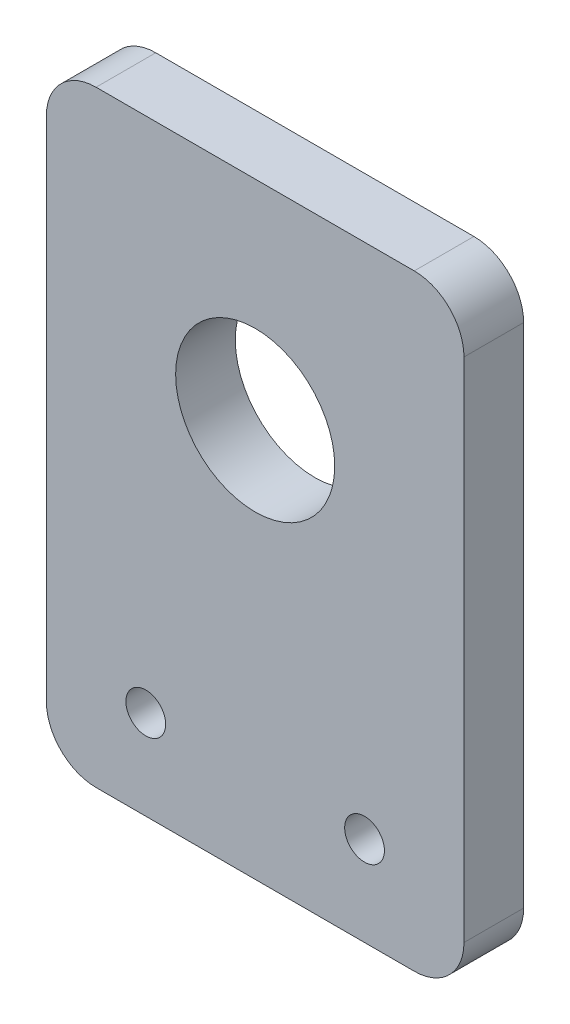
ISO-10303-21;
HEADER;
FILE_DESCRIPTION(('STEP AP214'),'2;1');
FILE_NAME('part.step','',(''),(''),'','','');
FILE_SCHEMA(('AUTOMOTIVE_DESIGN { 1 0 10303 214 1 1 1 1 }'));
ENDSEC;
DATA;
#1=APPLICATION_CONTEXT('core data for automotive mechanical design processes');
#2=APPLICATION_PROTOCOL_DEFINITION('international standard','automotive_design',2000,#1);
#3=PRODUCT_CONTEXT('',#1,'mechanical');
#4=PRODUCT('Part','Part','',(#3));
#5=PRODUCT_RELATED_PRODUCT_CATEGORY('part','',(#4));
#6=PRODUCT_DEFINITION_FORMATION('','',#4);
#7=PRODUCT_DEFINITION_CONTEXT('part definition',#1,'design');
#8=PRODUCT_DEFINITION('design','',#6,#7);
#9=PRODUCT_DEFINITION_SHAPE('','',#8);
#10=(LENGTH_UNIT() NAMED_UNIT(*) SI_UNIT(.MILLI.,.METRE.));
#11=(NAMED_UNIT(*) PLANE_ANGLE_UNIT() SI_UNIT($,.RADIAN.));
#12=(NAMED_UNIT(*) SI_UNIT($,.STERADIAN.) SOLID_ANGLE_UNIT());
#13=UNCERTAINTY_MEASURE_WITH_UNIT(LENGTH_MEASURE(1.E-05),#10,'distance_accuracy_value','');
#14=(GEOMETRIC_REPRESENTATION_CONTEXT(3) GLOBAL_UNCERTAINTY_ASSIGNED_CONTEXT((#13)) GLOBAL_UNIT_ASSIGNED_CONTEXT((#10,
#11,#12)) REPRESENTATION_CONTEXT('',''));
#15=CARTESIAN_POINT('',(0.,0.,0.));
#16=DIRECTION('',(0.,0.,1.));
#17=DIRECTION('',(1.,0.,0.));
#18=AXIS2_PLACEMENT_3D('',#15,#16,#17);
#19=CARTESIAN_POINT('',(5.,5.,6.));
#20=DIRECTION('',(0.,0.,-1.));
#21=DIRECTION('',(-1.,0.,0.));
#22=AXIS2_PLACEMENT_3D('',#19,#20,#21);
#23=PLANE('',#22);
#24=CARTESIAN_POINT('',(5.,5.,6.));
#25=DIRECTION('',(0.,0.,1.));
#26=DIRECTION('',(-1.,0.,0.));
#27=AXIS2_PLACEMENT_3D('',#24,#25,#26);
#28=CIRCLE('',#27,5.);
#29=CARTESIAN_POINT('',(0.,5.00000000000003,6.));
#30=VERTEX_POINT('',#29);
#31=CARTESIAN_POINT('',(5.00000000000003,0.,6.));
#32=VERTEX_POINT('',#31);
#33=EDGE_CURVE('E145',#30,#32,#28,.T.);
#34=ORIENTED_EDGE('',*,*,#33,.T.);
#35=DIRECTION('',(1.,0.,0.));
#36=VECTOR('',#35,1.);
#37=CARTESIAN_POINT('',(5.00000000000003,0.,6.));
#38=LINE('',#37,#36);
#39=CARTESIAN_POINT('',(37.,0.,6.));
#40=VERTEX_POINT('',#39);
#41=EDGE_CURVE('E93',#32,#40,#38,.T.);
#42=ORIENTED_EDGE('',*,*,#41,.T.);
#43=CARTESIAN_POINT('',(37.,5.,6.));
#44=DIRECTION('',(0.,0.,1.));
#45=DIRECTION('',(1.,0.,0.));
#46=AXIS2_PLACEMENT_3D('',#43,#44,#45);
#47=CIRCLE('',#46,5.);
#48=CARTESIAN_POINT('',(42.,5.,6.));
#49=VERTEX_POINT('',#48);
#50=EDGE_CURVE('E160',#40,#49,#47,.T.);
#51=ORIENTED_EDGE('',*,*,#50,.T.);
#52=DIRECTION('',(0.,1.,0.));
#53=VECTOR('',#52,1.);
#54=CARTESIAN_POINT('',(42.,5.00000000000003,6.));
#55=LINE('',#54,#53);
#56=CARTESIAN_POINT('',(42.,56.,6.));
#57=VERTEX_POINT('',#56);
#58=EDGE_CURVE('E173',#49,#57,#55,.T.);
#59=ORIENTED_EDGE('',*,*,#58,.T.);
#60=CARTESIAN_POINT('',(37.,56.,6.));
#61=DIRECTION('',(0.,0.,1.));
#62=DIRECTION('',(-1.,0.,0.));
#63=AXIS2_PLACEMENT_3D('',#60,#61,#62);
#64=CIRCLE('',#63,5.);
#65=CARTESIAN_POINT('',(37.,61.,6.));
#66=VERTEX_POINT('',#65);
#67=EDGE_CURVE('E112',#57,#66,#64,.T.);
#68=ORIENTED_EDGE('',*,*,#67,.T.);
#69=DIRECTION('',(-1.,0.,0.));
#70=VECTOR('',#69,1.);
#71=CARTESIAN_POINT('',(5.00000000000004,61.,6.));
#72=LINE('',#71,#70);
#73=CARTESIAN_POINT('',(5.00000000000004,61.,6.));
#74=VERTEX_POINT('',#73);
#75=EDGE_CURVE('E106',#66,#74,#72,.T.);
#76=ORIENTED_EDGE('',*,*,#75,.T.);
#77=CARTESIAN_POINT('',(5.,56.,6.));
#78=DIRECTION('',(0.,0.,1.));
#79=DIRECTION('',(-1.,0.,0.));
#80=AXIS2_PLACEMENT_3D('',#77,#78,#79);
#81=CIRCLE('',#80,5.);
#82=CARTESIAN_POINT('',(0.,56.,6.));
#83=VERTEX_POINT('',#82);
#84=EDGE_CURVE('E110',#74,#83,#81,.T.);
#85=ORIENTED_EDGE('',*,*,#84,.T.);
#86=DIRECTION('',(0.,-1.,0.));
#87=VECTOR('',#86,1.);
#88=CARTESIAN_POINT('',(0.,5.00000000000003,6.));
#89=LINE('',#88,#87);
#90=EDGE_CURVE('E50',#83,#30,#89,.T.);
#91=ORIENTED_EDGE('',*,*,#90,.T.);
#92=EDGE_LOOP('',(#34,#42,#51,#59,#68,#76,#85,#91));
#93=FACE_BOUND('',#92,.T.);
#94=CARTESIAN_POINT('',(21.,40.,6.));
#95=DIRECTION('',(0.,0.,1.));
#96=DIRECTION('',(1.,0.,0.));
#97=AXIS2_PLACEMENT_3D('',#94,#95,#96);
#98=CIRCLE('',#97,8.);
#99=CARTESIAN_POINT('',(29.,40.,6.));
#100=VERTEX_POINT('',#99);
#101=EDGE_CURVE('E134',#100,#100,#98,.T.);
#102=ORIENTED_EDGE('',*,*,#101,.F.);
#103=EDGE_LOOP('',(#102));
#104=FACE_BOUND('',#103,.T.);
#105=CARTESIAN_POINT('',(10.,9.,6.));
#106=DIRECTION('',(0.,0.,1.));
#107=DIRECTION('',(1.,0.,0.));
#108=AXIS2_PLACEMENT_3D('',#105,#106,#107);
#109=CIRCLE('',#108,2.);
#110=CARTESIAN_POINT('',(12.,9.,6.));
#111=VERTEX_POINT('',#110);
#112=EDGE_CURVE('E182',#111,#111,#109,.T.);
#113=ORIENTED_EDGE('',*,*,#112,.F.);
#114=EDGE_LOOP('',(#113));
#115=FACE_BOUND('',#114,.T.);
#116=CARTESIAN_POINT('',(32.,9.,6.));
#117=DIRECTION('',(0.,0.,1.));
#118=DIRECTION('',(1.,0.,0.));
#119=AXIS2_PLACEMENT_3D('',#116,#117,#118);
#120=CIRCLE('',#119,2.);
#121=CARTESIAN_POINT('',(34.,9.,6.));
#122=VERTEX_POINT('',#121);
#123=EDGE_CURVE('E188',#122,#122,#120,.T.);
#124=ORIENTED_EDGE('',*,*,#123,.F.);
#125=EDGE_LOOP('',(#124));
#126=FACE_BOUND('',#125,.T.);
#127=ADVANCED_FACE('F33',(#93,#104,#115,#126),#23,.F.);
#128=CARTESIAN_POINT('',(5.,5.,0.));
#129=DIRECTION('',(0.,0.,-1.));
#130=DIRECTION('',(-1.,0.,0.));
#131=AXIS2_PLACEMENT_3D('',#128,#129,#130);
#132=PLANE('',#131);
#133=CARTESIAN_POINT('',(10.,9.,0.));
#134=DIRECTION('',(0.,0.,1.));
#135=DIRECTION('',(1.,0.,0.));
#136=AXIS2_PLACEMENT_3D('',#133,#134,#135);
#137=CIRCLE('',#136,2.);
#138=CARTESIAN_POINT('',(12.,9.,0.));
#139=VERTEX_POINT('',#138);
#140=EDGE_CURVE('E185',#139,#139,#137,.T.);
#141=ORIENTED_EDGE('',*,*,#140,.T.);
#142=EDGE_LOOP('',(#141));
#143=FACE_BOUND('',#142,.T.);
#144=CARTESIAN_POINT('',(5.,5.,0.));
#145=DIRECTION('',(0.,0.,1.));
#146=DIRECTION('',(-1.,0.,0.));
#147=AXIS2_PLACEMENT_3D('',#144,#145,#146);
#148=CIRCLE('',#147,5.);
#149=CARTESIAN_POINT('',(0.,5.00000000000003,0.));
#150=VERTEX_POINT('',#149);
#151=CARTESIAN_POINT('',(5.00000000000003,0.,0.));
#152=VERTEX_POINT('',#151);
#153=EDGE_CURVE('E130',#150,#152,#148,.T.);
#154=ORIENTED_EDGE('',*,*,#153,.F.);
#155=DIRECTION('',(0.,-1.,0.));
#156=VECTOR('',#155,1.);
#157=CARTESIAN_POINT('',(0.,5.00000000000003,0.));
#158=LINE('',#157,#156);
#159=CARTESIAN_POINT('',(0.,56.,0.));
#160=VERTEX_POINT('',#159);
#161=EDGE_CURVE('E85',#160,#150,#158,.T.);
#162=ORIENTED_EDGE('',*,*,#161,.F.);
#163=CARTESIAN_POINT('',(5.,56.,0.));
#164=DIRECTION('',(0.,0.,1.));
#165=DIRECTION('',(-1.,0.,0.));
#166=AXIS2_PLACEMENT_3D('',#163,#164,#165);
#167=CIRCLE('',#166,5.);
#168=CARTESIAN_POINT('',(5.00000000000004,61.,0.));
#169=VERTEX_POINT('',#168);
#170=EDGE_CURVE('E79',#169,#160,#167,.T.);
#171=ORIENTED_EDGE('',*,*,#170,.F.);
#172=DIRECTION('',(-1.,0.,0.));
#173=VECTOR('',#172,1.);
#174=CARTESIAN_POINT('',(5.00000000000004,61.,0.));
#175=LINE('',#174,#173);
#176=CARTESIAN_POINT('',(37.,61.,0.));
#177=VERTEX_POINT('',#176);
#178=EDGE_CURVE('E120',#177,#169,#175,.T.);
#179=ORIENTED_EDGE('',*,*,#178,.F.);
#180=CARTESIAN_POINT('',(37.,56.,0.));
#181=DIRECTION('',(0.,0.,1.));
#182=DIRECTION('',(-1.,0.,0.));
#183=AXIS2_PLACEMENT_3D('',#180,#181,#182);
#184=CIRCLE('',#183,5.);
#185=CARTESIAN_POINT('',(42.,56.,0.));
#186=VERTEX_POINT('',#185);
#187=EDGE_CURVE('E140',#186,#177,#184,.T.);
#188=ORIENTED_EDGE('',*,*,#187,.F.);
#189=DIRECTION('',(0.,1.,0.));
#190=VECTOR('',#189,1.);
#191=CARTESIAN_POINT('',(42.,5.00000000000003,0.));
#192=LINE('',#191,#190);
#193=CARTESIAN_POINT('',(42.,5.,0.));
#194=VERTEX_POINT('',#193);
#195=EDGE_CURVE('E138',#194,#186,#192,.T.);
#196=ORIENTED_EDGE('',*,*,#195,.F.);
#197=CARTESIAN_POINT('',(37.,5.,0.));
#198=DIRECTION('',(0.,0.,1.));
#199=DIRECTION('',(1.,0.,0.));
#200=AXIS2_PLACEMENT_3D('',#197,#198,#199);
#201=CIRCLE('',#200,5.);
#202=CARTESIAN_POINT('',(37.,0.,0.));
#203=VERTEX_POINT('',#202);
#204=EDGE_CURVE('E136',#203,#194,#201,.T.);
#205=ORIENTED_EDGE('',*,*,#204,.F.);
#206=DIRECTION('',(1.,0.,0.));
#207=VECTOR('',#206,1.);
#208=CARTESIAN_POINT('',(5.00000000000003,0.,0.));
#209=LINE('',#208,#207);
#210=EDGE_CURVE('E133',#152,#203,#209,.T.);
#211=ORIENTED_EDGE('',*,*,#210,.F.);
#212=EDGE_LOOP('',(#154,#162,#171,#179,#188,#196,#205,#211));
#213=FACE_BOUND('',#212,.T.);
#214=CARTESIAN_POINT('',(21.,40.,0.));
#215=DIRECTION('',(0.,0.,1.));
#216=DIRECTION('',(1.,0.,0.));
#217=AXIS2_PLACEMENT_3D('',#214,#215,#216);
#218=CIRCLE('',#217,8.);
#219=CARTESIAN_POINT('',(29.,40.,0.));
#220=VERTEX_POINT('',#219);
#221=EDGE_CURVE('E179',#220,#220,#218,.T.);
#222=ORIENTED_EDGE('',*,*,#221,.T.);
#223=EDGE_LOOP('',(#222));
#224=FACE_BOUND('',#223,.T.);
#225=CARTESIAN_POINT('',(32.,9.,0.));
#226=DIRECTION('',(0.,0.,1.));
#227=DIRECTION('',(1.,0.,0.));
#228=AXIS2_PLACEMENT_3D('',#225,#226,#227);
#229=CIRCLE('',#228,2.);
#230=CARTESIAN_POINT('',(34.,9.,0.));
#231=VERTEX_POINT('',#230);
#232=EDGE_CURVE('E191',#231,#231,#229,.T.);
#233=ORIENTED_EDGE('',*,*,#232,.T.);
#234=EDGE_LOOP('',(#233));
#235=FACE_BOUND('',#234,.T.);
#236=ADVANCED_FACE('F164',(#143,#213,#224,#235),#132,.T.);
#237=CARTESIAN_POINT('',(5.,5.,6.));
#238=DIRECTION('',(0.,0.,-1.));
#239=DIRECTION('',(-1.,0.,0.));
#240=AXIS2_PLACEMENT_3D('',#237,#238,#239);
#241=CYLINDRICAL_SURFACE('',#240,5.);
#242=ORIENTED_EDGE('',*,*,#153,.T.);
#243=DIRECTION('',(0.,0.,-1.));
#244=VECTOR('',#243,1.);
#245=CARTESIAN_POINT('',(5.00000000000003,0.,6.));
#246=LINE('',#245,#244);
#247=EDGE_CURVE('E11',#32,#152,#246,.T.);
#248=ORIENTED_EDGE('',*,*,#247,.F.);
#249=ORIENTED_EDGE('',*,*,#33,.F.);
#250=DIRECTION('',(0.,0.,-1.));
#251=VECTOR('',#250,1.);
#252=CARTESIAN_POINT('',(0.,5.00000000000003,6.));
#253=LINE('',#252,#251);
#254=EDGE_CURVE('E126',#30,#150,#253,.T.);
#255=ORIENTED_EDGE('',*,*,#254,.T.);
#256=EDGE_LOOP('',(#242,#248,#249,#255));
#257=FACE_BOUND('',#256,.T.);
#258=ADVANCED_FACE('F35',(#257),#241,.T.);
#259=CARTESIAN_POINT('',(5.00000000000003,0.,6.));
#260=DIRECTION('',(0.,1.,0.));
#261=DIRECTION('',(0.,0.,1.));
#262=AXIS2_PLACEMENT_3D('',#259,#260,#261);
#263=PLANE('',#262);
#264=ORIENTED_EDGE('',*,*,#210,.T.);
#265=DIRECTION('',(0.,0.,-1.));
#266=VECTOR('',#265,1.);
#267=CARTESIAN_POINT('',(37.,0.,6.));
#268=LINE('',#267,#266);
#269=EDGE_CURVE('E42',#40,#203,#268,.T.);
#270=ORIENTED_EDGE('',*,*,#269,.F.);
#271=ORIENTED_EDGE('',*,*,#41,.F.);
#272=ORIENTED_EDGE('',*,*,#247,.T.);
#273=EDGE_LOOP('',(#264,#270,#271,#272));
#274=FACE_BOUND('',#273,.T.);
#275=ADVANCED_FACE('F223',(#274),#263,.F.);
#276=CARTESIAN_POINT('',(37.,5.,6.));
#277=DIRECTION('',(0.,0.,-1.));
#278=DIRECTION('',(-1.,0.,0.));
#279=AXIS2_PLACEMENT_3D('',#276,#277,#278);
#280=CYLINDRICAL_SURFACE('',#279,5.);
#281=ORIENTED_EDGE('',*,*,#204,.T.);
#282=DIRECTION('',(0.,0.,-1.));
#283=VECTOR('',#282,1.);
#284=CARTESIAN_POINT('',(42.,5.,6.));
#285=LINE('',#284,#283);
#286=EDGE_CURVE('E152',#49,#194,#285,.T.);
#287=ORIENTED_EDGE('',*,*,#286,.F.);
#288=ORIENTED_EDGE('',*,*,#50,.F.);
#289=ORIENTED_EDGE('',*,*,#269,.T.);
#290=EDGE_LOOP('',(#281,#287,#288,#289));
#291=FACE_BOUND('',#290,.T.);
#292=ADVANCED_FACE('F158',(#291),#280,.T.);
#293=CARTESIAN_POINT('',(42.,5.00000000000003,6.));
#294=DIRECTION('',(-1.,0.,0.));
#295=DIRECTION('',(0.,0.,1.));
#296=AXIS2_PLACEMENT_3D('',#293,#294,#295);
#297=PLANE('',#296);
#298=ORIENTED_EDGE('',*,*,#195,.T.);
#299=DIRECTION('',(0.,0.,-1.));
#300=VECTOR('',#299,1.);
#301=CARTESIAN_POINT('',(42.,56.,6.));
#302=LINE('',#301,#300);
#303=EDGE_CURVE('E149',#57,#186,#302,.T.);
#304=ORIENTED_EDGE('',*,*,#303,.F.);
#305=ORIENTED_EDGE('',*,*,#58,.F.);
#306=ORIENTED_EDGE('',*,*,#286,.T.);
#307=EDGE_LOOP('',(#298,#304,#305,#306));
#308=FACE_BOUND('',#307,.T.);
#309=ADVANCED_FACE('F169',(#308),#297,.F.);
#310=CARTESIAN_POINT('',(37.,56.,6.));
#311=DIRECTION('',(0.,0.,-1.));
#312=DIRECTION('',(-1.,0.,0.));
#313=AXIS2_PLACEMENT_3D('',#310,#311,#312);
#314=CYLINDRICAL_SURFACE('',#313,5.);
#315=ORIENTED_EDGE('',*,*,#187,.T.);
#316=DIRECTION('',(0.,0.,-1.));
#317=VECTOR('',#316,1.);
#318=CARTESIAN_POINT('',(37.,61.,6.));
#319=LINE('',#318,#317);
#320=EDGE_CURVE('E121',#66,#177,#319,.T.);
#321=ORIENTED_EDGE('',*,*,#320,.F.);
#322=ORIENTED_EDGE('',*,*,#67,.F.);
#323=ORIENTED_EDGE('',*,*,#303,.T.);
#324=EDGE_LOOP('',(#315,#321,#322,#323));
#325=FACE_BOUND('',#324,.T.);
#326=ADVANCED_FACE('F172',(#325),#314,.T.);
#327=CARTESIAN_POINT('',(5.00000000000004,61.,6.));
#328=DIRECTION('',(0.,-1.,0.));
#329=DIRECTION('',(0.,0.,-1.));
#330=AXIS2_PLACEMENT_3D('',#327,#328,#329);
#331=PLANE('',#330);
#332=ORIENTED_EDGE('',*,*,#178,.T.);
#333=DIRECTION('',(0.,0.,-1.));
#334=VECTOR('',#333,1.);
#335=CARTESIAN_POINT('',(5.00000000000004,61.,6.));
#336=LINE('',#335,#334);
#337=EDGE_CURVE('E117',#74,#169,#336,.T.);
#338=ORIENTED_EDGE('',*,*,#337,.F.);
#339=ORIENTED_EDGE('',*,*,#75,.F.);
#340=ORIENTED_EDGE('',*,*,#320,.T.);
#341=EDGE_LOOP('',(#332,#338,#339,#340));
#342=FACE_BOUND('',#341,.T.);
#343=ADVANCED_FACE('F118',(#342),#331,.F.);
#344=CARTESIAN_POINT('',(5.,56.,6.));
#345=DIRECTION('',(0.,0.,-1.));
#346=DIRECTION('',(-1.,0.,0.));
#347=AXIS2_PLACEMENT_3D('',#344,#345,#346);
#348=CYLINDRICAL_SURFACE('',#347,5.);
#349=ORIENTED_EDGE('',*,*,#170,.T.);
#350=DIRECTION('',(0.,0.,-1.));
#351=VECTOR('',#350,1.);
#352=CARTESIAN_POINT('',(0.,56.,6.));
#353=LINE('',#352,#351);
#354=EDGE_CURVE('E122',#83,#160,#353,.T.);
#355=ORIENTED_EDGE('',*,*,#354,.F.);
#356=ORIENTED_EDGE('',*,*,#84,.F.);
#357=ORIENTED_EDGE('',*,*,#337,.T.);
#358=EDGE_LOOP('',(#349,#355,#356,#357));
#359=FACE_BOUND('',#358,.T.);
#360=ADVANCED_FACE('F124',(#359),#348,.T.);
#361=CARTESIAN_POINT('',(0.,5.00000000000003,6.));
#362=DIRECTION('',(1.,0.,0.));
#363=DIRECTION('',(0.,0.,-1.));
#364=AXIS2_PLACEMENT_3D('',#361,#362,#363);
#365=PLANE('',#364);
#366=ORIENTED_EDGE('',*,*,#161,.T.);
#367=ORIENTED_EDGE('',*,*,#254,.F.);
#368=ORIENTED_EDGE('',*,*,#90,.F.);
#369=ORIENTED_EDGE('',*,*,#354,.T.);
#370=EDGE_LOOP('',(#366,#367,#368,#369));
#371=FACE_BOUND('',#370,.T.);
#372=ADVANCED_FACE('F211',(#371),#365,.F.);
#373=CARTESIAN_POINT('',(21.,40.,6.));
#374=DIRECTION('',(0.,0.,-1.));
#375=DIRECTION('',(-1.,0.,0.));
#376=AXIS2_PLACEMENT_3D('',#373,#374,#375);
#377=CYLINDRICAL_SURFACE('',#376,8.);
#378=ORIENTED_EDGE('',*,*,#101,.T.);
#379=EDGE_LOOP('',(#378));
#380=FACE_BOUND('',#379,.T.);
#381=ORIENTED_EDGE('',*,*,#221,.F.);
#382=EDGE_LOOP('',(#381));
#383=FACE_BOUND('',#382,.T.);
#384=ADVANCED_FACE('F208',(#380,#383),#377,.F.);
#385=CARTESIAN_POINT('',(10.,9.,6.));
#386=DIRECTION('',(0.,0.,-1.));
#387=DIRECTION('',(-1.,0.,0.));
#388=AXIS2_PLACEMENT_3D('',#385,#386,#387);
#389=CYLINDRICAL_SURFACE('',#388,2.);
#390=ORIENTED_EDGE('',*,*,#112,.T.);
#391=EDGE_LOOP('',(#390));
#392=FACE_BOUND('',#391,.T.);
#393=ORIENTED_EDGE('',*,*,#140,.F.);
#394=EDGE_LOOP('',(#393));
#395=FACE_BOUND('',#394,.T.);
#396=ADVANCED_FACE('F287',(#392,#395),#389,.F.);
#397=CARTESIAN_POINT('',(32.,9.,6.));
#398=DIRECTION('',(0.,0.,-1.));
#399=DIRECTION('',(-1.,0.,0.));
#400=AXIS2_PLACEMENT_3D('',#397,#398,#399);
#401=CYLINDRICAL_SURFACE('',#400,2.);
#402=ORIENTED_EDGE('',*,*,#123,.T.);
#403=EDGE_LOOP('',(#402));
#404=FACE_BOUND('',#403,.T.);
#405=ORIENTED_EDGE('',*,*,#232,.F.);
#406=EDGE_LOOP('',(#405));
#407=FACE_BOUND('',#406,.T.);
#408=ADVANCED_FACE('F197',(#404,#407),#401,.F.);
#409=CLOSED_SHELL('',(#127,#236,#258,#275,#292,#309,#326,#343,#360,#372,#384,#396,#408));
#410=MANIFOLD_SOLID_BREP('B2',#409);
#411=ADVANCED_BREP_SHAPE_REPRESENTATION('',(#18,#410),#14);
#412=SHAPE_DEFINITION_REPRESENTATION(#9,#411);
ENDSEC;
END-ISO-10303-21;
